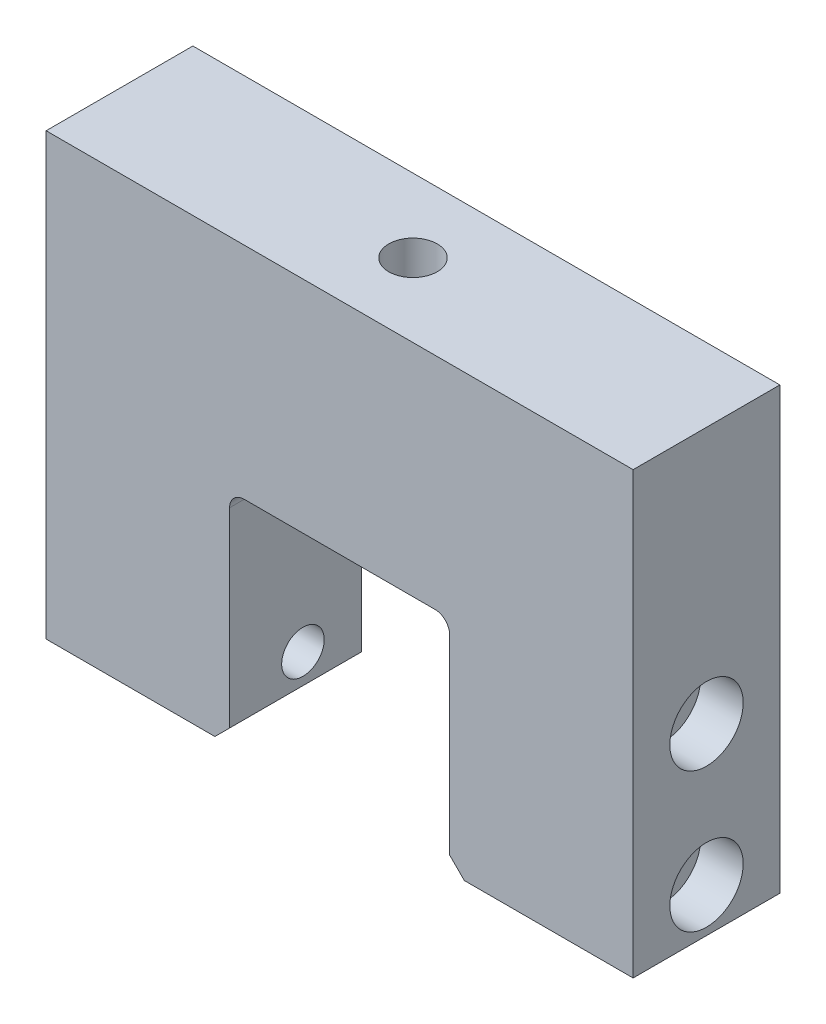
ISO-10303-21;
HEADER;
FILE_DESCRIPTION(('STEP AP214'),'2;1');
FILE_NAME('part.step','',(''),(''),'','','');
FILE_SCHEMA(('AUTOMOTIVE_DESIGN { 1 0 10303 214 1 1 1 1 }'));
ENDSEC;
DATA;
#1=APPLICATION_CONTEXT('core data for automotive mechanical design processes');
#2=APPLICATION_PROTOCOL_DEFINITION('international standard','automotive_design',2000,#1);
#3=PRODUCT_CONTEXT('',#1,'mechanical');
#4=PRODUCT('Part','Part','',(#3));
#5=PRODUCT_RELATED_PRODUCT_CATEGORY('part','',(#4));
#6=PRODUCT_DEFINITION_FORMATION('','',#4);
#7=PRODUCT_DEFINITION_CONTEXT('part definition',#1,'design');
#8=PRODUCT_DEFINITION('design','',#6,#7);
#9=PRODUCT_DEFINITION_SHAPE('','',#8);
#10=(LENGTH_UNIT() NAMED_UNIT(*) SI_UNIT(.MILLI.,.METRE.));
#11=(NAMED_UNIT(*) PLANE_ANGLE_UNIT() SI_UNIT($,.RADIAN.));
#12=(NAMED_UNIT(*) SI_UNIT($,.STERADIAN.) SOLID_ANGLE_UNIT());
#13=UNCERTAINTY_MEASURE_WITH_UNIT(LENGTH_MEASURE(1.E-05),#10,'distance_accuracy_value','');
#14=(GEOMETRIC_REPRESENTATION_CONTEXT(3) GLOBAL_UNCERTAINTY_ASSIGNED_CONTEXT((#13)) GLOBAL_UNIT_ASSIGNED_CONTEXT((#10,
#11,#12)) REPRESENTATION_CONTEXT('',''));
#15=CARTESIAN_POINT('',(0.,0.,0.));
#16=DIRECTION('',(0.,0.,1.));
#17=DIRECTION('',(1.,0.,0.));
#18=AXIS2_PLACEMENT_3D('',#15,#16,#17);
#19=CARTESIAN_POINT('',(20.,-15.,10.));
#20=DIRECTION('',(0.,1.,0.));
#21=DIRECTION('',(-1.,0.,0.));
#22=AXIS2_PLACEMENT_3D('',#19,#20,#21);
#23=PLANE('',#22);
#24=DIRECTION('',(1.,0.,0.));
#25=VECTOR('',#24,1.);
#26=CARTESIAN_POINT('',(20.,-15.,10.));
#27=LINE('',#26,#25);
#28=CARTESIAN_POINT('',(8.49999999999999,-15.,10.));
#29=VERTEX_POINT('',#28);
#30=CARTESIAN_POINT('',(20.,-15.,10.));
#31=VERTEX_POINT('',#30);
#32=EDGE_CURVE('E285',#29,#31,#27,.T.);
#33=ORIENTED_EDGE('',*,*,#32,.F.);
#34=DIRECTION('',(0.,0.,-1.));
#35=VECTOR('',#34,1.);
#36=CARTESIAN_POINT('',(8.49999999999999,-15.,10.));
#37=LINE('',#36,#35);
#38=CARTESIAN_POINT('',(8.49999999999999,-15.,0.));
#39=VERTEX_POINT('',#38);
#40=EDGE_CURVE('E363',#29,#39,#37,.T.);
#41=ORIENTED_EDGE('',*,*,#40,.T.);
#42=DIRECTION('',(1.,0.,0.));
#43=VECTOR('',#42,1.);
#44=CARTESIAN_POINT('',(20.,-15.,0.));
#45=LINE('',#44,#43);
#46=CARTESIAN_POINT('',(20.,-15.,0.));
#47=VERTEX_POINT('',#46);
#48=EDGE_CURVE('E301',#39,#47,#45,.T.);
#49=ORIENTED_EDGE('',*,*,#48,.T.);
#50=DIRECTION('',(0.,0.,-1.));
#51=VECTOR('',#50,1.);
#52=CARTESIAN_POINT('',(20.,-15.,10.));
#53=LINE('',#52,#51);
#54=EDGE_CURVE('E318',#31,#47,#53,.T.);
#55=ORIENTED_EDGE('',*,*,#54,.F.);
#56=EDGE_LOOP('',(#33,#41,#49,#55));
#57=FACE_BOUND('',#56,.T.);
#58=ADVANCED_FACE('F48',(#57),#23,.F.);
#59=CARTESIAN_POINT('',(-20.,15.,10.));
#60=DIRECTION('',(1.,0.,0.));
#61=DIRECTION('',(0.,0.,-1.));
#62=AXIS2_PLACEMENT_3D('',#59,#60,#61);
#63=PLANE('',#62);
#64=CARTESIAN_POINT('',(-20.,-2.50000000000001,5.));
#65=DIRECTION('',(-1.,0.,0.));
#66=DIRECTION('',(0.,0.,1.));
#67=AXIS2_PLACEMENT_3D('',#64,#65,#66);
#68=CIRCLE('',#67,2.5);
#69=CARTESIAN_POINT('',(-20.,-2.50000000000001,7.5));
#70=VERTEX_POINT('',#69);
#71=EDGE_CURVE('E237',#70,#70,#68,.T.);
#72=ORIENTED_EDGE('',*,*,#71,.F.);
#73=EDGE_LOOP('',(#72));
#74=FACE_BOUND('',#73,.T.);
#75=CARTESIAN_POINT('',(-20.,-12.,5.));
#76=DIRECTION('',(-1.,0.,0.));
#77=DIRECTION('',(0.,0.,1.));
#78=AXIS2_PLACEMENT_3D('',#75,#76,#77);
#79=CIRCLE('',#78,2.5);
#80=CARTESIAN_POINT('',(-20.,-12.,7.5));
#81=VERTEX_POINT('',#80);
#82=EDGE_CURVE('E253',#81,#81,#79,.T.);
#83=ORIENTED_EDGE('',*,*,#82,.F.);
#84=EDGE_LOOP('',(#83));
#85=FACE_BOUND('',#84,.T.);
#86=DIRECTION('',(0.,-1.,0.));
#87=VECTOR('',#86,1.);
#88=CARTESIAN_POINT('',(-20.,15.,0.));
#89=LINE('',#88,#87);
#90=CARTESIAN_POINT('',(-20.,15.,0.));
#91=VERTEX_POINT('',#90);
#92=CARTESIAN_POINT('',(-20.,-15.,0.));
#93=VERTEX_POINT('',#92);
#94=EDGE_CURVE('E280',#91,#93,#89,.T.);
#95=ORIENTED_EDGE('',*,*,#94,.T.);
#96=DIRECTION('',(0.,0.,-1.));
#97=VECTOR('',#96,1.);
#98=CARTESIAN_POINT('',(-20.,-15.,10.));
#99=LINE('',#98,#97);
#100=CARTESIAN_POINT('',(-20.,-15.,10.));
#101=VERTEX_POINT('',#100);
#102=EDGE_CURVE('E322',#101,#93,#99,.T.);
#103=ORIENTED_EDGE('',*,*,#102,.F.);
#104=DIRECTION('',(0.,-1.,0.));
#105=VECTOR('',#104,1.);
#106=CARTESIAN_POINT('',(-20.,15.,10.));
#107=LINE('',#106,#105);
#108=CARTESIAN_POINT('',(-20.,15.,10.));
#109=VERTEX_POINT('',#108);
#110=EDGE_CURVE('E281',#109,#101,#107,.T.);
#111=ORIENTED_EDGE('',*,*,#110,.F.);
#112=DIRECTION('',(0.,0.,-1.));
#113=VECTOR('',#112,1.);
#114=CARTESIAN_POINT('',(-20.,15.,10.));
#115=LINE('',#114,#113);
#116=EDGE_CURVE('E297',#109,#91,#115,.T.);
#117=ORIENTED_EDGE('',*,*,#116,.T.);
#118=EDGE_LOOP('',(#95,#103,#111,#117));
#119=FACE_BOUND('',#118,.T.);
#120=ADVANCED_FACE('F483',(#74,#85,#119),#63,.F.);
#121=CARTESIAN_POINT('',(-8.50000000000001,-15.,0.));
#122=VERTEX_POINT('',#121);
#123=EDGE_CURVE('E302',#93,#122,#45,.T.);
#124=ORIENTED_EDGE('',*,*,#123,.T.);
#125=DIRECTION('',(0.,0.,1.));
#126=VECTOR('',#125,1.);
#127=CARTESIAN_POINT('',(-8.50000000000001,-15.,10.));
#128=LINE('',#127,#126);
#129=CARTESIAN_POINT('',(-8.50000000000001,-15.,10.));
#130=VERTEX_POINT('',#129);
#131=EDGE_CURVE('E346',#122,#130,#128,.T.);
#132=ORIENTED_EDGE('',*,*,#131,.T.);
#133=EDGE_CURVE('E287',#101,#130,#27,.T.);
#134=ORIENTED_EDGE('',*,*,#133,.F.);
#135=ORIENTED_EDGE('',*,*,#102,.T.);
#136=EDGE_LOOP('',(#124,#132,#134,#135));
#137=FACE_BOUND('',#136,.T.);
#138=ADVANCED_FACE('F428',(#137),#23,.F.);
#139=CARTESIAN_POINT('',(20.,15.,10.));
#140=DIRECTION('',(-1.,0.,0.));
#141=DIRECTION('',(0.,-1.,0.));
#142=AXIS2_PLACEMENT_3D('',#139,#140,#141);
#143=PLANE('',#142);
#144=CARTESIAN_POINT('',(20.,-2.50000000000001,5.));
#145=DIRECTION('',(1.,0.,0.));
#146=DIRECTION('',(0.,0.,-1.));
#147=AXIS2_PLACEMENT_3D('',#144,#145,#146);
#148=CIRCLE('',#147,2.5);
#149=CARTESIAN_POINT('',(20.,-2.50000000000001,2.5));
#150=VERTEX_POINT('',#149);
#151=EDGE_CURVE('E205',#150,#150,#148,.T.);
#152=ORIENTED_EDGE('',*,*,#151,.F.);
#153=EDGE_LOOP('',(#152));
#154=FACE_BOUND('',#153,.T.);
#155=CARTESIAN_POINT('',(20.,-12.,5.));
#156=DIRECTION('',(1.,0.,0.));
#157=DIRECTION('',(0.,0.,-1.));
#158=AXIS2_PLACEMENT_3D('',#155,#156,#157);
#159=CIRCLE('',#158,2.5);
#160=CARTESIAN_POINT('',(20.,-12.,2.5));
#161=VERTEX_POINT('',#160);
#162=EDGE_CURVE('E221',#161,#161,#159,.T.);
#163=ORIENTED_EDGE('',*,*,#162,.F.);
#164=EDGE_LOOP('',(#163));
#165=FACE_BOUND('',#164,.T.);
#166=DIRECTION('',(0.,1.,0.));
#167=VECTOR('',#166,1.);
#168=CARTESIAN_POINT('',(20.,15.,0.));
#169=LINE('',#168,#167);
#170=CARTESIAN_POINT('',(20.,15.,0.));
#171=VERTEX_POINT('',#170);
#172=EDGE_CURVE('E306',#47,#171,#169,.T.);
#173=ORIENTED_EDGE('',*,*,#172,.T.);
#174=DIRECTION('',(0.,0.,-1.));
#175=VECTOR('',#174,1.);
#176=CARTESIAN_POINT('',(20.,15.,10.));
#177=LINE('',#176,#175);
#178=CARTESIAN_POINT('',(20.,15.,10.));
#179=VERTEX_POINT('',#178);
#180=EDGE_CURVE('E314',#179,#171,#177,.T.);
#181=ORIENTED_EDGE('',*,*,#180,.F.);
#182=DIRECTION('',(0.,1.,0.));
#183=VECTOR('',#182,1.);
#184=CARTESIAN_POINT('',(20.,15.,10.));
#185=LINE('',#184,#183);
#186=EDGE_CURVE('E291',#31,#179,#185,.T.);
#187=ORIENTED_EDGE('',*,*,#186,.F.);
#188=ORIENTED_EDGE('',*,*,#54,.T.);
#189=EDGE_LOOP('',(#173,#181,#187,#188));
#190=FACE_BOUND('',#189,.T.);
#191=ADVANCED_FACE('F492',(#154,#165,#190),#143,.F.);
#192=CARTESIAN_POINT('',(20.,15.,10.));
#193=DIRECTION('',(0.,-1.,0.));
#194=DIRECTION('',(1.,0.,0.));
#195=AXIS2_PLACEMENT_3D('',#192,#193,#194);
#196=PLANE('',#195);
#197=CARTESIAN_POINT('',(0.,15.,5.00000000000001));
#198=DIRECTION('',(0.,1.,0.));
#199=DIRECTION('',(0.,0.,1.));
#200=AXIS2_PLACEMENT_3D('',#197,#198,#199);
#201=CIRCLE('',#200,1.64999999999999);
#202=CARTESIAN_POINT('',(0.,15.,6.64999999999999));
#203=VERTEX_POINT('',#202);
#204=EDGE_CURVE('E602',#203,#203,#201,.T.);
#205=ORIENTED_EDGE('',*,*,#204,.F.);
#206=EDGE_LOOP('',(#205));
#207=FACE_BOUND('',#206,.T.);
#208=DIRECTION('',(-1.,0.,0.));
#209=VECTOR('',#208,1.);
#210=CARTESIAN_POINT('',(20.,15.,0.));
#211=LINE('',#210,#209);
#212=EDGE_CURVE('E286',#171,#91,#211,.T.);
#213=ORIENTED_EDGE('',*,*,#212,.T.);
#214=ORIENTED_EDGE('',*,*,#116,.F.);
#215=DIRECTION('',(-1.,0.,0.));
#216=VECTOR('',#215,1.);
#217=CARTESIAN_POINT('',(20.,15.,10.));
#218=LINE('',#217,#216);
#219=EDGE_CURVE('E294',#179,#109,#218,.T.);
#220=ORIENTED_EDGE('',*,*,#219,.F.);
#221=ORIENTED_EDGE('',*,*,#180,.T.);
#222=EDGE_LOOP('',(#213,#214,#220,#221));
#223=FACE_BOUND('',#222,.T.);
#224=ADVANCED_FACE('F496',(#207,#223),#196,.F.);
#225=CARTESIAN_POINT('',(0.,0.,10.));
#226=DIRECTION('',(0.,0.,-1.));
#227=DIRECTION('',(-1.,0.,0.));
#228=AXIS2_PLACEMENT_3D('',#225,#226,#227);
#229=PLANE('',#228);
#230=ORIENTED_EDGE('',*,*,#133,.T.);
#231=DIRECTION('',(-0.707106781186549,-0.707106781186546,0.));
#232=VECTOR('',#231,1.);
#233=CARTESIAN_POINT('',(-8.50000000000001,-15.,10.));
#234=LINE('',#233,#232);
#235=CARTESIAN_POINT('',(-7.5,-14.,10.));
#236=VERTEX_POINT('',#235);
#237=EDGE_CURVE('E353',#130,#236,#234,.F.);
#238=ORIENTED_EDGE('',*,*,#237,.T.);
#239=DIRECTION('',(0.,-1.,0.));
#240=VECTOR('',#239,1.);
#241=CARTESIAN_POINT('',(-7.5,0.,10.));
#242=LINE('',#241,#240);
#243=CARTESIAN_POINT('',(-7.5,-1.00000000000001,10.));
#244=VERTEX_POINT('',#243);
#245=EDGE_CURVE('E276',#244,#236,#242,.T.);
#246=ORIENTED_EDGE('',*,*,#245,.F.);
#247=CARTESIAN_POINT('',(-6.5,-1.00000000000001,10.));
#248=DIRECTION('',(0.,0.,-1.));
#249=DIRECTION('',(-1.,0.,0.));
#250=AXIS2_PLACEMENT_3D('',#247,#248,#249);
#251=CIRCLE('',#250,1.);
#252=CARTESIAN_POINT('',(-6.5,0.,10.));
#253=VERTEX_POINT('',#252);
#254=EDGE_CURVE('E343',#244,#253,#251,.T.);
#255=ORIENTED_EDGE('',*,*,#254,.T.);
#256=DIRECTION('',(-1.,0.,0.));
#257=VECTOR('',#256,1.);
#258=CARTESIAN_POINT('',(-7.5,0.,10.));
#259=LINE('',#258,#257);
#260=CARTESIAN_POINT('',(6.5,0.,10.));
#261=VERTEX_POINT('',#260);
#262=EDGE_CURVE('E272',#261,#253,#259,.T.);
#263=ORIENTED_EDGE('',*,*,#262,.F.);
#264=CARTESIAN_POINT('',(6.5,-1.00000000000001,10.));
#265=DIRECTION('',(0.,0.,-1.));
#266=DIRECTION('',(-1.,0.,0.));
#267=AXIS2_PLACEMENT_3D('',#264,#265,#266);
#268=CIRCLE('',#267,1.);
#269=CARTESIAN_POINT('',(7.5,-1.00000000000001,10.));
#270=VERTEX_POINT('',#269);
#271=EDGE_CURVE('E339',#261,#270,#268,.T.);
#272=ORIENTED_EDGE('',*,*,#271,.T.);
#273=DIRECTION('',(0.,1.,0.));
#274=VECTOR('',#273,1.);
#275=CARTESIAN_POINT('',(7.5,0.,10.));
#276=LINE('',#275,#274);
#277=CARTESIAN_POINT('',(7.5,-14.,10.));
#278=VERTEX_POINT('',#277);
#279=EDGE_CURVE('E269',#278,#270,#276,.T.);
#280=ORIENTED_EDGE('',*,*,#279,.F.);
#281=DIRECTION('',(-0.70710678118655,0.707106781186545,0.));
#282=VECTOR('',#281,1.);
#283=CARTESIAN_POINT('',(7.5,-14.,10.));
#284=LINE('',#283,#282);
#285=EDGE_CURVE('E350',#278,#29,#284,.F.);
#286=ORIENTED_EDGE('',*,*,#285,.T.);
#287=ORIENTED_EDGE('',*,*,#32,.T.);
#288=ORIENTED_EDGE('',*,*,#186,.T.);
#289=ORIENTED_EDGE('',*,*,#219,.T.);
#290=ORIENTED_EDGE('',*,*,#110,.T.);
#291=EDGE_LOOP('',(#230,#238,#246,#255,#263,#272,#280,#286,#287,#288,#289,#290));
#292=FACE_BOUND('',#291,.T.);
#293=ADVANCED_FACE('F435',(#292),#229,.F.);
#294=CARTESIAN_POINT('',(0.,0.,0.));
#295=DIRECTION('',(0.,0.,-1.));
#296=DIRECTION('',(-1.,0.,0.));
#297=AXIS2_PLACEMENT_3D('',#294,#295,#296);
#298=PLANE('',#297);
#299=ORIENTED_EDGE('',*,*,#48,.F.);
#300=DIRECTION('',(0.,1.,0.));
#301=VECTOR('',#300,1.);
#302=CARTESIAN_POINT('',(8.50000000000001,-1.00000000000001,0.));
#303=LINE('',#302,#301);
#304=CARTESIAN_POINT('',(8.50000000000001,-1.00000000000001,0.));
#305=VERTEX_POINT('',#304);
#306=EDGE_CURVE('E379',#39,#305,#303,.T.);
#307=ORIENTED_EDGE('',*,*,#306,.T.);
#308=CARTESIAN_POINT('',(6.5,-1.00000000000001,0.));
#309=DIRECTION('',(0.,0.,-1.));
#310=DIRECTION('',(-1.,0.,0.));
#311=AXIS2_PLACEMENT_3D('',#308,#309,#310);
#312=CIRCLE('',#311,2.00000000000001);
#313=CARTESIAN_POINT('',(6.5,1.,0.));
#314=VERTEX_POINT('',#313);
#315=EDGE_CURVE('E373',#305,#314,#312,.F.);
#316=ORIENTED_EDGE('',*,*,#315,.T.);
#317=DIRECTION('',(-1.,0.,0.));
#318=VECTOR('',#317,1.);
#319=CARTESIAN_POINT('',(-6.5,1.,0.));
#320=LINE('',#319,#318);
#321=CARTESIAN_POINT('',(-6.5,1.,0.));
#322=VERTEX_POINT('',#321);
#323=EDGE_CURVE('E367',#314,#322,#320,.T.);
#324=ORIENTED_EDGE('',*,*,#323,.T.);
#325=CARTESIAN_POINT('',(-6.5,-1.00000000000001,0.));
#326=DIRECTION('',(0.,0.,-1.));
#327=DIRECTION('',(-1.,0.,0.));
#328=AXIS2_PLACEMENT_3D('',#325,#326,#327);
#329=CIRCLE('',#328,2.00000000000001);
#330=CARTESIAN_POINT('',(-8.50000000000001,-1.00000000000001,0.));
#331=VERTEX_POINT('',#330);
#332=EDGE_CURVE('E370',#322,#331,#329,.F.);
#333=ORIENTED_EDGE('',*,*,#332,.T.);
#334=DIRECTION('',(0.,-1.,0.));
#335=VECTOR('',#334,1.);
#336=CARTESIAN_POINT('',(-8.50000000000001,-14.,0.));
#337=LINE('',#336,#335);
#338=EDGE_CURVE('E376',#331,#122,#337,.T.);
#339=ORIENTED_EDGE('',*,*,#338,.T.);
#340=ORIENTED_EDGE('',*,*,#123,.F.);
#341=ORIENTED_EDGE('',*,*,#94,.F.);
#342=ORIENTED_EDGE('',*,*,#212,.F.);
#343=ORIENTED_EDGE('',*,*,#172,.F.);
#344=EDGE_LOOP('',(#299,#307,#316,#324,#333,#339,#340,#341,#342,#343));
#345=FACE_BOUND('',#344,.T.);
#346=CARTESIAN_POINT('',(13.75,-7.,0.));
#347=DIRECTION('',(0.,0.,-1.));
#348=DIRECTION('',(-1.,0.,0.));
#349=AXIS2_PLACEMENT_3D('',#346,#347,#348);
#350=CIRCLE('',#349,1.65);
#351=CARTESIAN_POINT('',(12.1,-7.,0.));
#352=VERTEX_POINT('',#351);
#353=EDGE_CURVE('E174',#352,#352,#350,.T.);
#354=ORIENTED_EDGE('',*,*,#353,.F.);
#355=EDGE_LOOP('',(#354));
#356=FACE_BOUND('',#355,.T.);
#357=CARTESIAN_POINT('',(13.75,11.,0.));
#358=DIRECTION('',(0.,0.,-1.));
#359=DIRECTION('',(-1.,0.,0.));
#360=AXIS2_PLACEMENT_3D('',#357,#358,#359);
#361=CIRCLE('',#360,1.65);
#362=CARTESIAN_POINT('',(12.1,11.,0.));
#363=VERTEX_POINT('',#362);
#364=EDGE_CURVE('E173',#363,#363,#361,.T.);
#365=ORIENTED_EDGE('',*,*,#364,.F.);
#366=EDGE_LOOP('',(#365));
#367=FACE_BOUND('',#366,.T.);
#368=CARTESIAN_POINT('',(-13.75,11.,0.));
#369=DIRECTION('',(0.,0.,-1.));
#370=DIRECTION('',(-1.,0.,0.));
#371=AXIS2_PLACEMENT_3D('',#368,#369,#370);
#372=CIRCLE('',#371,1.65);
#373=CARTESIAN_POINT('',(-15.4,11.,0.));
#374=VERTEX_POINT('',#373);
#375=EDGE_CURVE('E189',#374,#374,#372,.T.);
#376=ORIENTED_EDGE('',*,*,#375,.F.);
#377=EDGE_LOOP('',(#376));
#378=FACE_BOUND('',#377,.T.);
#379=CARTESIAN_POINT('',(-13.75,-7.,0.));
#380=DIRECTION('',(0.,0.,-1.));
#381=DIRECTION('',(-1.,0.,0.));
#382=AXIS2_PLACEMENT_3D('',#379,#380,#381);
#383=CIRCLE('',#382,1.65);
#384=CARTESIAN_POINT('',(-15.4,-7.,0.));
#385=VERTEX_POINT('',#384);
#386=EDGE_CURVE('E197',#385,#385,#383,.T.);
#387=ORIENTED_EDGE('',*,*,#386,.F.);
#388=EDGE_LOOP('',(#387));
#389=FACE_BOUND('',#388,.T.);
#390=ADVANCED_FACE('F423',(#345,#356,#367,#378,#389),#298,.T.);
#391=CARTESIAN_POINT('',(7.5,0.,0.));
#392=DIRECTION('',(1.,0.,0.));
#393=DIRECTION('',(0.,1.,0.));
#394=AXIS2_PLACEMENT_3D('',#391,#392,#393);
#395=PLANE('',#394);
#396=CARTESIAN_POINT('',(7.5,-2.50000000000001,5.));
#397=DIRECTION('',(1.,0.,0.));
#398=DIRECTION('',(0.,1.,0.));
#399=AXIS2_PLACEMENT_3D('',#396,#397,#398);
#400=CIRCLE('',#399,1.45);
#401=CARTESIAN_POINT('',(7.5,-1.05000000000001,5.));
#402=VERTEX_POINT('',#401);
#403=EDGE_CURVE('E217',#402,#402,#400,.T.);
#404=ORIENTED_EDGE('',*,*,#403,.T.);
#405=EDGE_LOOP('',(#404));
#406=FACE_BOUND('',#405,.T.);
#407=CARTESIAN_POINT('',(7.5,-12.,5.));
#408=DIRECTION('',(1.,0.,0.));
#409=DIRECTION('',(0.,1.,0.));
#410=AXIS2_PLACEMENT_3D('',#407,#408,#409);
#411=CIRCLE('',#410,1.45);
#412=CARTESIAN_POINT('',(7.5,-10.55,5.));
#413=VERTEX_POINT('',#412);
#414=EDGE_CURVE('E233',#413,#413,#411,.T.);
#415=ORIENTED_EDGE('',*,*,#414,.T.);
#416=EDGE_LOOP('',(#415));
#417=FACE_BOUND('',#416,.T.);
#418=DIRECTION('',(0.,0.,1.));
#419=VECTOR('',#418,1.);
#420=CARTESIAN_POINT('',(7.5,-1.00000000000001,0.));
#421=LINE('',#420,#419);
#422=CARTESIAN_POINT('',(7.5,-1.00000000000001,1.00000000000001));
#423=VERTEX_POINT('',#422);
#424=EDGE_CURVE('E332',#270,#423,#421,.F.);
#425=ORIENTED_EDGE('',*,*,#424,.T.);
#426=DIRECTION('',(0.,-1.,0.));
#427=VECTOR('',#426,1.);
#428=CARTESIAN_POINT('',(7.5,-14.,1.00000000000001));
#429=LINE('',#428,#427);
#430=CARTESIAN_POINT('',(7.5,-14.,1.00000000000001));
#431=VERTEX_POINT('',#430);
#432=EDGE_CURVE('E383',#423,#431,#429,.T.);
#433=ORIENTED_EDGE('',*,*,#432,.T.);
#434=DIRECTION('',(0.,0.,1.));
#435=VECTOR('',#434,1.);
#436=CARTESIAN_POINT('',(7.5,-14.,0.));
#437=LINE('',#436,#435);
#438=EDGE_CURVE('E360',#431,#278,#437,.T.);
#439=ORIENTED_EDGE('',*,*,#438,.T.);
#440=ORIENTED_EDGE('',*,*,#279,.T.);
#441=EDGE_LOOP('',(#425,#433,#439,#440));
#442=FACE_BOUND('',#441,.T.);
#443=ADVANCED_FACE('F451',(#406,#417,#442),#395,.F.);
#444=CARTESIAN_POINT('',(-7.5,0.,0.));
#445=DIRECTION('',(-1.,0.,0.));
#446=DIRECTION('',(0.,-1.,0.));
#447=AXIS2_PLACEMENT_3D('',#444,#445,#446);
#448=PLANE('',#447);
#449=CARTESIAN_POINT('',(-7.5,-2.50000000000001,5.));
#450=DIRECTION('',(-1.,0.,0.));
#451=DIRECTION('',(0.,-1.,0.));
#452=AXIS2_PLACEMENT_3D('',#449,#450,#451);
#453=CIRCLE('',#452,1.45);
#454=CARTESIAN_POINT('',(-7.5,-3.95000000000001,5.));
#455=VERTEX_POINT('',#454);
#456=EDGE_CURVE('E249',#455,#455,#453,.T.);
#457=ORIENTED_EDGE('',*,*,#456,.T.);
#458=EDGE_LOOP('',(#457));
#459=FACE_BOUND('',#458,.T.);
#460=CARTESIAN_POINT('',(-7.5,-12.,5.));
#461=DIRECTION('',(-1.,0.,0.));
#462=DIRECTION('',(0.,-1.,0.));
#463=AXIS2_PLACEMENT_3D('',#460,#461,#462);
#464=CIRCLE('',#463,1.45);
#465=CARTESIAN_POINT('',(-7.5,-13.45,5.));
#466=VERTEX_POINT('',#465);
#467=EDGE_CURVE('E265',#466,#466,#464,.T.);
#468=ORIENTED_EDGE('',*,*,#467,.T.);
#469=EDGE_LOOP('',(#468));
#470=FACE_BOUND('',#469,.T.);
#471=DIRECTION('',(0.,0.,-1.));
#472=VECTOR('',#471,1.);
#473=CARTESIAN_POINT('',(-7.5,-14.,0.));
#474=LINE('',#473,#472);
#475=CARTESIAN_POINT('',(-7.5,-14.,1.00000000000001));
#476=VERTEX_POINT('',#475);
#477=EDGE_CURVE('E356',#236,#476,#474,.T.);
#478=ORIENTED_EDGE('',*,*,#477,.T.);
#479=DIRECTION('',(0.,1.,0.));
#480=VECTOR('',#479,1.);
#481=CARTESIAN_POINT('',(-7.5,-1.00000000000001,1.00000000000001));
#482=LINE('',#481,#480);
#483=CARTESIAN_POINT('',(-7.5,-1.00000000000001,1.00000000000001));
#484=VERTEX_POINT('',#483);
#485=EDGE_CURVE('E392',#476,#484,#482,.T.);
#486=ORIENTED_EDGE('',*,*,#485,.T.);
#487=DIRECTION('',(0.,0.,1.));
#488=VECTOR('',#487,1.);
#489=CARTESIAN_POINT('',(-7.5,-1.00000000000001,10.));
#490=LINE('',#489,#488);
#491=EDGE_CURVE('E336',#484,#244,#490,.T.);
#492=ORIENTED_EDGE('',*,*,#491,.T.);
#493=ORIENTED_EDGE('',*,*,#245,.T.);
#494=EDGE_LOOP('',(#478,#486,#492,#493));
#495=FACE_BOUND('',#494,.T.);
#496=ADVANCED_FACE('F437',(#459,#470,#495),#448,.F.);
#497=CARTESIAN_POINT('',(-7.5,0.,0.));
#498=DIRECTION('',(0.,1.,0.));
#499=DIRECTION('',(0.,0.,1.));
#500=AXIS2_PLACEMENT_3D('',#497,#498,#499);
#501=PLANE('',#500);
#502=CARTESIAN_POINT('',(0.,0.,5.00000000000001));
#503=DIRECTION('',(0.,1.,0.));
#504=DIRECTION('',(0.,0.,1.));
#505=AXIS2_PLACEMENT_3D('',#502,#503,#504);
#506=CIRCLE('',#505,1.64999999999999);
#507=CARTESIAN_POINT('',(0.,0.,6.65));
#508=VERTEX_POINT('',#507);
#509=EDGE_CURVE('E53',#508,#508,#506,.T.);
#510=ORIENTED_EDGE('',*,*,#509,.T.);
#511=EDGE_LOOP('',(#510));
#512=FACE_BOUND('',#511,.T.);
#513=DIRECTION('',(0.,0.,1.));
#514=VECTOR('',#513,1.);
#515=CARTESIAN_POINT('',(-6.5,0.,0.));
#516=LINE('',#515,#514);
#517=CARTESIAN_POINT('',(-6.5,0.,1.00000000000001));
#518=VERTEX_POINT('',#517);
#519=EDGE_CURVE('E326',#253,#518,#516,.F.);
#520=ORIENTED_EDGE('',*,*,#519,.T.);
#521=DIRECTION('',(1.,0.,0.));
#522=VECTOR('',#521,1.);
#523=CARTESIAN_POINT('',(6.5,0.,1.00000000000001));
#524=LINE('',#523,#522);
#525=CARTESIAN_POINT('',(6.5,0.,1.00000000000001));
#526=VERTEX_POINT('',#525);
#527=EDGE_CURVE('E11',#518,#526,#524,.T.);
#528=ORIENTED_EDGE('',*,*,#527,.T.);
#529=DIRECTION('',(0.,0.,1.));
#530=VECTOR('',#529,1.);
#531=CARTESIAN_POINT('',(6.5,0.,10.));
#532=LINE('',#531,#530);
#533=EDGE_CURVE('E329',#526,#261,#532,.T.);
#534=ORIENTED_EDGE('',*,*,#533,.T.);
#535=ORIENTED_EDGE('',*,*,#262,.T.);
#536=EDGE_LOOP('',(#520,#528,#534,#535));
#537=FACE_BOUND('',#536,.T.);
#538=ADVANCED_FACE('F441',(#512,#537),#501,.F.);
#539=CARTESIAN_POINT('',(-20.,-12.,5.));
#540=DIRECTION('',(-1.,0.,0.));
#541=DIRECTION('',(0.,0.,1.));
#542=AXIS2_PLACEMENT_3D('',#539,#540,#541);
#543=CYLINDRICAL_SURFACE('',#542,1.45);
#544=ORIENTED_EDGE('',*,*,#467,.F.);
#545=EDGE_LOOP('',(#544));
#546=FACE_BOUND('',#545,.T.);
#547=CARTESIAN_POINT('',(-17.1,-12.,5.));
#548=DIRECTION('',(-1.,0.,0.));
#549=DIRECTION('',(0.,0.,1.));
#550=AXIS2_PLACEMENT_3D('',#547,#548,#549);
#551=CIRCLE('',#550,1.45);
#552=CARTESIAN_POINT('',(-17.1,-12.,6.45));
#553=VERTEX_POINT('',#552);
#554=EDGE_CURVE('E261',#553,#553,#551,.T.);
#555=ORIENTED_EDGE('',*,*,#554,.T.);
#556=EDGE_LOOP('',(#555));
#557=FACE_BOUND('',#556,.T.);
#558=ADVANCED_FACE('F515',(#546,#557),#543,.F.);
#559=CARTESIAN_POINT('',(-17.1,-10.55,5.));
#560=DIRECTION('',(1.,0.,0.));
#561=DIRECTION('',(0.,0.,-1.));
#562=AXIS2_PLACEMENT_3D('',#559,#560,#561);
#563=PLANE('',#562);
#564=ORIENTED_EDGE('',*,*,#554,.F.);
#565=EDGE_LOOP('',(#564));
#566=FACE_BOUND('',#565,.T.);
#567=CARTESIAN_POINT('',(-17.1,-12.,5.));
#568=DIRECTION('',(-1.,0.,0.));
#569=DIRECTION('',(0.,0.,1.));
#570=AXIS2_PLACEMENT_3D('',#567,#568,#569);
#571=CIRCLE('',#570,2.5);
#572=CARTESIAN_POINT('',(-17.1,-12.,7.5));
#573=VERTEX_POINT('',#572);
#574=EDGE_CURVE('E257',#573,#573,#571,.T.);
#575=ORIENTED_EDGE('',*,*,#574,.T.);
#576=EDGE_LOOP('',(#575));
#577=FACE_BOUND('',#576,.T.);
#578=ADVANCED_FACE('F522',(#566,#577),#563,.F.);
#579=CARTESIAN_POINT('',(-20.,-12.,5.));
#580=DIRECTION('',(-1.,0.,0.));
#581=DIRECTION('',(0.,0.,1.));
#582=AXIS2_PLACEMENT_3D('',#579,#580,#581);
#583=CYLINDRICAL_SURFACE('',#582,2.5);
#584=ORIENTED_EDGE('',*,*,#574,.F.);
#585=EDGE_LOOP('',(#584));
#586=FACE_BOUND('',#585,.T.);
#587=ORIENTED_EDGE('',*,*,#82,.T.);
#588=EDGE_LOOP('',(#587));
#589=FACE_BOUND('',#588,.T.);
#590=ADVANCED_FACE('F526',(#586,#589),#583,.F.);
#591=CARTESIAN_POINT('',(-20.,-2.50000000000001,5.));
#592=DIRECTION('',(-1.,0.,0.));
#593=DIRECTION('',(0.,0.,1.));
#594=AXIS2_PLACEMENT_3D('',#591,#592,#593);
#595=CYLINDRICAL_SURFACE('',#594,1.45);
#596=ORIENTED_EDGE('',*,*,#456,.F.);
#597=EDGE_LOOP('',(#596));
#598=FACE_BOUND('',#597,.T.);
#599=CARTESIAN_POINT('',(-17.1,-2.50000000000001,5.));
#600=DIRECTION('',(-1.,0.,0.));
#601=DIRECTION('',(0.,0.,1.));
#602=AXIS2_PLACEMENT_3D('',#599,#600,#601);
#603=CIRCLE('',#602,1.45);
#604=CARTESIAN_POINT('',(-17.1,-2.50000000000001,6.45));
#605=VERTEX_POINT('',#604);
#606=EDGE_CURVE('E245',#605,#605,#603,.T.);
#607=ORIENTED_EDGE('',*,*,#606,.T.);
#608=EDGE_LOOP('',(#607));
#609=FACE_BOUND('',#608,.T.);
#610=ADVANCED_FACE('F530',(#598,#609),#595,.F.);
#611=CARTESIAN_POINT('',(-17.1,-1.05000000000001,5.));
#612=DIRECTION('',(1.,0.,0.));
#613=DIRECTION('',(0.,0.,-1.));
#614=AXIS2_PLACEMENT_3D('',#611,#612,#613);
#615=PLANE('',#614);
#616=ORIENTED_EDGE('',*,*,#606,.F.);
#617=EDGE_LOOP('',(#616));
#618=FACE_BOUND('',#617,.T.);
#619=CARTESIAN_POINT('',(-17.1,-2.50000000000001,5.));
#620=DIRECTION('',(-1.,0.,0.));
#621=DIRECTION('',(0.,0.,1.));
#622=AXIS2_PLACEMENT_3D('',#619,#620,#621);
#623=CIRCLE('',#622,2.5);
#624=CARTESIAN_POINT('',(-17.1,-2.50000000000001,7.5));
#625=VERTEX_POINT('',#624);
#626=EDGE_CURVE('E241',#625,#625,#623,.T.);
#627=ORIENTED_EDGE('',*,*,#626,.T.);
#628=EDGE_LOOP('',(#627));
#629=FACE_BOUND('',#628,.T.);
#630=ADVANCED_FACE('F534',(#618,#629),#615,.F.);
#631=CARTESIAN_POINT('',(-20.,-2.50000000000001,5.));
#632=DIRECTION('',(-1.,0.,0.));
#633=DIRECTION('',(0.,0.,1.));
#634=AXIS2_PLACEMENT_3D('',#631,#632,#633);
#635=CYLINDRICAL_SURFACE('',#634,2.5);
#636=ORIENTED_EDGE('',*,*,#626,.F.);
#637=EDGE_LOOP('',(#636));
#638=FACE_BOUND('',#637,.T.);
#639=ORIENTED_EDGE('',*,*,#71,.T.);
#640=EDGE_LOOP('',(#639));
#641=FACE_BOUND('',#640,.T.);
#642=ADVANCED_FACE('F538',(#638,#641),#635,.F.);
#643=CARTESIAN_POINT('',(20.,-12.,5.));
#644=DIRECTION('',(1.,0.,0.));
#645=DIRECTION('',(0.,0.,-1.));
#646=AXIS2_PLACEMENT_3D('',#643,#644,#645);
#647=CYLINDRICAL_SURFACE('',#646,1.45);
#648=ORIENTED_EDGE('',*,*,#414,.F.);
#649=EDGE_LOOP('',(#648));
#650=FACE_BOUND('',#649,.T.);
#651=CARTESIAN_POINT('',(17.1,-12.,5.));
#652=DIRECTION('',(1.,0.,0.));
#653=DIRECTION('',(0.,0.,-1.));
#654=AXIS2_PLACEMENT_3D('',#651,#652,#653);
#655=CIRCLE('',#654,1.45);
#656=CARTESIAN_POINT('',(17.1,-12.,3.55));
#657=VERTEX_POINT('',#656);
#658=EDGE_CURVE('E229',#657,#657,#655,.T.);
#659=ORIENTED_EDGE('',*,*,#658,.T.);
#660=EDGE_LOOP('',(#659));
#661=FACE_BOUND('',#660,.T.);
#662=ADVANCED_FACE('F542',(#650,#661),#647,.F.);
#663=CARTESIAN_POINT('',(17.1,-10.55,5.));
#664=DIRECTION('',(-1.,0.,0.));
#665=DIRECTION('',(0.,0.,1.));
#666=AXIS2_PLACEMENT_3D('',#663,#664,#665);
#667=PLANE('',#666);
#668=ORIENTED_EDGE('',*,*,#658,.F.);
#669=EDGE_LOOP('',(#668));
#670=FACE_BOUND('',#669,.T.);
#671=CARTESIAN_POINT('',(17.1,-12.,5.));
#672=DIRECTION('',(1.,0.,0.));
#673=DIRECTION('',(0.,0.,-1.));
#674=AXIS2_PLACEMENT_3D('',#671,#672,#673);
#675=CIRCLE('',#674,2.5);
#676=CARTESIAN_POINT('',(17.1,-12.,2.5));
#677=VERTEX_POINT('',#676);
#678=EDGE_CURVE('E225',#677,#677,#675,.T.);
#679=ORIENTED_EDGE('',*,*,#678,.T.);
#680=EDGE_LOOP('',(#679));
#681=FACE_BOUND('',#680,.T.);
#682=ADVANCED_FACE('F546',(#670,#681),#667,.F.);
#683=CARTESIAN_POINT('',(20.,-12.,5.));
#684=DIRECTION('',(1.,0.,0.));
#685=DIRECTION('',(0.,0.,-1.));
#686=AXIS2_PLACEMENT_3D('',#683,#684,#685);
#687=CYLINDRICAL_SURFACE('',#686,2.5);
#688=ORIENTED_EDGE('',*,*,#678,.F.);
#689=EDGE_LOOP('',(#688));
#690=FACE_BOUND('',#689,.T.);
#691=ORIENTED_EDGE('',*,*,#162,.T.);
#692=EDGE_LOOP('',(#691));
#693=FACE_BOUND('',#692,.T.);
#694=ADVANCED_FACE('F550',(#690,#693),#687,.F.);
#695=CARTESIAN_POINT('',(20.,-2.50000000000001,5.));
#696=DIRECTION('',(1.,0.,0.));
#697=DIRECTION('',(0.,0.,-1.));
#698=AXIS2_PLACEMENT_3D('',#695,#696,#697);
#699=CYLINDRICAL_SURFACE('',#698,1.45);
#700=ORIENTED_EDGE('',*,*,#403,.F.);
#701=EDGE_LOOP('',(#700));
#702=FACE_BOUND('',#701,.T.);
#703=CARTESIAN_POINT('',(17.1,-2.50000000000001,5.));
#704=DIRECTION('',(1.,0.,0.));
#705=DIRECTION('',(0.,0.,-1.));
#706=AXIS2_PLACEMENT_3D('',#703,#704,#705);
#707=CIRCLE('',#706,1.45);
#708=CARTESIAN_POINT('',(17.1,-2.50000000000001,3.55));
#709=VERTEX_POINT('',#708);
#710=EDGE_CURVE('E213',#709,#709,#707,.T.);
#711=ORIENTED_EDGE('',*,*,#710,.T.);
#712=EDGE_LOOP('',(#711));
#713=FACE_BOUND('',#712,.T.);
#714=ADVANCED_FACE('F554',(#702,#713),#699,.F.);
#715=CARTESIAN_POINT('',(17.1,-1.05000000000001,5.));
#716=DIRECTION('',(-1.,0.,0.));
#717=DIRECTION('',(0.,0.,1.));
#718=AXIS2_PLACEMENT_3D('',#715,#716,#717);
#719=PLANE('',#718);
#720=ORIENTED_EDGE('',*,*,#710,.F.);
#721=EDGE_LOOP('',(#720));
#722=FACE_BOUND('',#721,.T.);
#723=CARTESIAN_POINT('',(17.1,-2.50000000000001,5.));
#724=DIRECTION('',(1.,0.,0.));
#725=DIRECTION('',(0.,0.,-1.));
#726=AXIS2_PLACEMENT_3D('',#723,#724,#725);
#727=CIRCLE('',#726,2.5);
#728=CARTESIAN_POINT('',(17.1,-2.50000000000001,2.5));
#729=VERTEX_POINT('',#728);
#730=EDGE_CURVE('E209',#729,#729,#727,.T.);
#731=ORIENTED_EDGE('',*,*,#730,.T.);
#732=EDGE_LOOP('',(#731));
#733=FACE_BOUND('',#732,.T.);
#734=ADVANCED_FACE('F558',(#722,#733),#719,.F.);
#735=CARTESIAN_POINT('',(20.,-2.50000000000001,5.));
#736=DIRECTION('',(1.,0.,0.));
#737=DIRECTION('',(0.,0.,-1.));
#738=AXIS2_PLACEMENT_3D('',#735,#736,#737);
#739=CYLINDRICAL_SURFACE('',#738,2.5);
#740=ORIENTED_EDGE('',*,*,#730,.F.);
#741=EDGE_LOOP('',(#740));
#742=FACE_BOUND('',#741,.T.);
#743=ORIENTED_EDGE('',*,*,#151,.T.);
#744=EDGE_LOOP('',(#743));
#745=FACE_BOUND('',#744,.T.);
#746=ADVANCED_FACE('F562',(#742,#745),#739,.F.);
#747=CARTESIAN_POINT('',(-13.75,-7.,5.));
#748=DIRECTION('',(0.,0.,-1.));
#749=DIRECTION('',(-1.,0.,0.));
#750=AXIS2_PLACEMENT_3D('',#747,#748,#749);
#751=CONICAL_SURFACE('',#750,1.65,1.02974425867665);
#752=CARTESIAN_POINT('',(-13.75,-7.,5.99142002139547));
#753=VERTEX_POINT('',#752);
#754=VERTEX_LOOP('',#753);
#755=FACE_BOUND('',#754,.T.);
#756=CARTESIAN_POINT('',(-13.75,-7.,5.));
#757=DIRECTION('',(0.,0.,-1.));
#758=DIRECTION('',(-1.,0.,0.));
#759=AXIS2_PLACEMENT_3D('',#756,#757,#758);
#760=CIRCLE('',#759,1.65);
#761=CARTESIAN_POINT('',(-15.4,-7.,5.));
#762=VERTEX_POINT('',#761);
#763=EDGE_CURVE('E201',#762,#762,#760,.T.);
#764=ORIENTED_EDGE('',*,*,#763,.T.);
#765=EDGE_LOOP('',(#764));
#766=FACE_BOUND('',#765,.T.);
#767=ADVANCED_FACE('F566',(#755,#766),#751,.F.);
#768=CARTESIAN_POINT('',(-13.75,-7.,0.));
#769=DIRECTION('',(0.,0.,-1.));
#770=DIRECTION('',(-1.,0.,0.));
#771=AXIS2_PLACEMENT_3D('',#768,#769,#770);
#772=CYLINDRICAL_SURFACE('',#771,1.65);
#773=ORIENTED_EDGE('',*,*,#763,.F.);
#774=EDGE_LOOP('',(#773));
#775=FACE_BOUND('',#774,.T.);
#776=ORIENTED_EDGE('',*,*,#386,.T.);
#777=EDGE_LOOP('',(#776));
#778=FACE_BOUND('',#777,.T.);
#779=ADVANCED_FACE('F570',(#775,#778),#772,.F.);
#780=CARTESIAN_POINT('',(-13.75,11.,5.));
#781=DIRECTION('',(0.,0.,-1.));
#782=DIRECTION('',(-1.,0.,0.));
#783=AXIS2_PLACEMENT_3D('',#780,#781,#782);
#784=CONICAL_SURFACE('',#783,1.65,1.02974425867665);
#785=CARTESIAN_POINT('',(-13.75,11.,5.99142002139547));
#786=VERTEX_POINT('',#785);
#787=VERTEX_LOOP('',#786);
#788=FACE_BOUND('',#787,.T.);
#789=CARTESIAN_POINT('',(-13.75,11.,5.));
#790=DIRECTION('',(0.,0.,-1.));
#791=DIRECTION('',(-1.,0.,0.));
#792=AXIS2_PLACEMENT_3D('',#789,#790,#791);
#793=CIRCLE('',#792,1.65);
#794=CARTESIAN_POINT('',(-15.4,11.,5.));
#795=VERTEX_POINT('',#794);
#796=EDGE_CURVE('E193',#795,#795,#793,.T.);
#797=ORIENTED_EDGE('',*,*,#796,.T.);
#798=EDGE_LOOP('',(#797));
#799=FACE_BOUND('',#798,.T.);
#800=ADVANCED_FACE('F574',(#788,#799),#784,.F.);
#801=CARTESIAN_POINT('',(-13.75,11.,0.));
#802=DIRECTION('',(0.,0.,-1.));
#803=DIRECTION('',(-1.,0.,0.));
#804=AXIS2_PLACEMENT_3D('',#801,#802,#803);
#805=CYLINDRICAL_SURFACE('',#804,1.65);
#806=ORIENTED_EDGE('',*,*,#796,.F.);
#807=EDGE_LOOP('',(#806));
#808=FACE_BOUND('',#807,.T.);
#809=ORIENTED_EDGE('',*,*,#375,.T.);
#810=EDGE_LOOP('',(#809));
#811=FACE_BOUND('',#810,.T.);
#812=ADVANCED_FACE('F578',(#808,#811),#805,.F.);
#813=CARTESIAN_POINT('',(13.75,11.,5.));
#814=DIRECTION('',(0.,0.,-1.));
#815=DIRECTION('',(-1.,0.,0.));
#816=AXIS2_PLACEMENT_3D('',#813,#814,#815);
#817=CONICAL_SURFACE('',#816,1.65,1.02974425867665);
#818=CARTESIAN_POINT('',(13.75,11.,5.99142002139547));
#819=VERTEX_POINT('',#818);
#820=VERTEX_LOOP('',#819);
#821=FACE_BOUND('',#820,.T.);
#822=CARTESIAN_POINT('',(13.75,11.,5.));
#823=DIRECTION('',(0.,0.,-1.));
#824=DIRECTION('',(-1.,0.,0.));
#825=AXIS2_PLACEMENT_3D('',#822,#823,#824);
#826=CIRCLE('',#825,1.65);
#827=CARTESIAN_POINT('',(12.1,11.,5.));
#828=VERTEX_POINT('',#827);
#829=EDGE_CURVE('E179',#828,#828,#826,.T.);
#830=ORIENTED_EDGE('',*,*,#829,.T.);
#831=EDGE_LOOP('',(#830));
#832=FACE_BOUND('',#831,.T.);
#833=ADVANCED_FACE('F582',(#821,#832),#817,.F.);
#834=CARTESIAN_POINT('',(13.75,11.,0.));
#835=DIRECTION('',(0.,0.,-1.));
#836=DIRECTION('',(-1.,0.,0.));
#837=AXIS2_PLACEMENT_3D('',#834,#835,#836);
#838=CYLINDRICAL_SURFACE('',#837,1.65);
#839=ORIENTED_EDGE('',*,*,#829,.F.);
#840=EDGE_LOOP('',(#839));
#841=FACE_BOUND('',#840,.T.);
#842=ORIENTED_EDGE('',*,*,#364,.T.);
#843=EDGE_LOOP('',(#842));
#844=FACE_BOUND('',#843,.T.);
#845=ADVANCED_FACE('F166',(#841,#844),#838,.F.);
#846=CARTESIAN_POINT('',(13.75,-7.,5.));
#847=DIRECTION('',(0.,0.,-1.));
#848=DIRECTION('',(-1.,0.,0.));
#849=AXIS2_PLACEMENT_3D('',#846,#847,#848);
#850=CONICAL_SURFACE('',#849,1.65,1.02974425867665);
#851=CARTESIAN_POINT('',(13.75,-7.,5.99142002139547));
#852=VERTEX_POINT('',#851);
#853=VERTEX_LOOP('',#852);
#854=FACE_BOUND('',#853,.T.);
#855=CARTESIAN_POINT('',(13.75,-7.,5.));
#856=DIRECTION('',(0.,0.,-1.));
#857=DIRECTION('',(-1.,0.,0.));
#858=AXIS2_PLACEMENT_3D('',#855,#856,#857);
#859=CIRCLE('',#858,1.65);
#860=CARTESIAN_POINT('',(12.1,-7.,5.));
#861=VERTEX_POINT('',#860);
#862=EDGE_CURVE('E170',#861,#861,#859,.T.);
#863=ORIENTED_EDGE('',*,*,#862,.T.);
#864=EDGE_LOOP('',(#863));
#865=FACE_BOUND('',#864,.T.);
#866=ADVANCED_FACE('F162',(#854,#865),#850,.F.);
#867=CARTESIAN_POINT('',(13.75,-7.,0.));
#868=DIRECTION('',(0.,0.,-1.));
#869=DIRECTION('',(-1.,0.,0.));
#870=AXIS2_PLACEMENT_3D('',#867,#868,#869);
#871=CYLINDRICAL_SURFACE('',#870,1.65);
#872=ORIENTED_EDGE('',*,*,#862,.F.);
#873=EDGE_LOOP('',(#872));
#874=FACE_BOUND('',#873,.T.);
#875=ORIENTED_EDGE('',*,*,#353,.T.);
#876=EDGE_LOOP('',(#875));
#877=FACE_BOUND('',#876,.T.);
#878=ADVANCED_FACE('F165',(#874,#877),#871,.F.);
#879=CARTESIAN_POINT('',(6.5,-1.00000000000001,0.));
#880=DIRECTION('',(0.,0.,-1.));
#881=DIRECTION('',(-1.,0.,0.));
#882=AXIS2_PLACEMENT_3D('',#879,#880,#881);
#883=CYLINDRICAL_SURFACE('',#882,1.);
#884=ORIENTED_EDGE('',*,*,#533,.F.);
#885=CARTESIAN_POINT('',(6.5,-1.00000000000001,1.00000000000001));
#886=DIRECTION('',(0.,0.,-1.));
#887=DIRECTION('',(-1.,0.,0.));
#888=AXIS2_PLACEMENT_3D('',#885,#886,#887);
#889=CIRCLE('',#888,1.);
#890=EDGE_CURVE('E395',#526,#423,#889,.T.);
#891=ORIENTED_EDGE('',*,*,#890,.T.);
#892=ORIENTED_EDGE('',*,*,#424,.F.);
#893=ORIENTED_EDGE('',*,*,#271,.F.);
#894=EDGE_LOOP('',(#884,#891,#892,#893));
#895=FACE_BOUND('',#894,.T.);
#896=ADVANCED_FACE('F446',(#895),#883,.F.);
#897=CARTESIAN_POINT('',(-6.5,-1.00000000000001,0.));
#898=DIRECTION('',(0.,0.,-1.));
#899=DIRECTION('',(-1.,0.,0.));
#900=AXIS2_PLACEMENT_3D('',#897,#898,#899);
#901=CYLINDRICAL_SURFACE('',#900,1.);
#902=ORIENTED_EDGE('',*,*,#491,.F.);
#903=CARTESIAN_POINT('',(-6.5,-1.00000000000001,1.00000000000001));
#904=DIRECTION('',(0.,0.,-1.));
#905=DIRECTION('',(-1.,0.,0.));
#906=AXIS2_PLACEMENT_3D('',#903,#904,#905);
#907=CIRCLE('',#906,1.);
#908=EDGE_CURVE('E59',#484,#518,#907,.T.);
#909=ORIENTED_EDGE('',*,*,#908,.T.);
#910=ORIENTED_EDGE('',*,*,#519,.F.);
#911=ORIENTED_EDGE('',*,*,#254,.F.);
#912=EDGE_LOOP('',(#902,#909,#910,#911));
#913=FACE_BOUND('',#912,.T.);
#914=ADVANCED_FACE('F439',(#913),#901,.F.);
#915=CARTESIAN_POINT('',(-8.50000000000001,-15.,10.));
#916=DIRECTION('',(-0.707106781186546,0.707106781186549,0.));
#917=DIRECTION('',(0.,0.,1.));
#918=AXIS2_PLACEMENT_3D('',#915,#916,#917);
#919=PLANE('',#918);
#920=ORIENTED_EDGE('',*,*,#131,.F.);
#921=DIRECTION('',(-0.577350269189626,-0.577350269189624,-0.577350269189627));
#922=VECTOR('',#921,1.);
#923=CARTESIAN_POINT('',(-5.16666666666667,-11.6666666666667,3.33333333333334));
#924=LINE('',#923,#922);
#925=EDGE_CURVE('E389',#122,#476,#924,.F.);
#926=ORIENTED_EDGE('',*,*,#925,.T.);
#927=ORIENTED_EDGE('',*,*,#477,.F.);
#928=ORIENTED_EDGE('',*,*,#237,.F.);
#929=EDGE_LOOP('',(#920,#926,#927,#928));
#930=FACE_BOUND('',#929,.T.);
#931=ADVANCED_FACE('F431',(#930),#919,.F.);
#932=CARTESIAN_POINT('',(7.5,-14.,0.));
#933=DIRECTION('',(0.707106781186545,0.70710678118655,0.));
#934=DIRECTION('',(0.,0.,1.));
#935=AXIS2_PLACEMENT_3D('',#932,#933,#934);
#936=PLANE('',#935);
#937=ORIENTED_EDGE('',*,*,#438,.F.);
#938=DIRECTION('',(-0.577350269189627,0.577350269189623,0.577350269189627));
#939=VECTOR('',#938,1.);
#940=CARTESIAN_POINT('',(7.83333333333334,-14.3333333333333,0.66666666666667));
#941=LINE('',#940,#939);
#942=EDGE_CURVE('E386',#431,#39,#941,.F.);
#943=ORIENTED_EDGE('',*,*,#942,.T.);
#944=ORIENTED_EDGE('',*,*,#40,.F.);
#945=ORIENTED_EDGE('',*,*,#285,.F.);
#946=EDGE_LOOP('',(#937,#943,#944,#945));
#947=FACE_BOUND('',#946,.T.);
#948=ADVANCED_FACE('F457',(#947),#936,.F.);
#949=CARTESIAN_POINT('',(-8.50000000000001,0.,0.));
#950=DIRECTION('',(0.707106781186547,0.,-0.707106781186547));
#951=DIRECTION('',(0.,1.,0.));
#952=AXIS2_PLACEMENT_3D('',#949,#950,#951);
#953=PLANE('',#952);
#954=ORIENTED_EDGE('',*,*,#925,.F.);
#955=ORIENTED_EDGE('',*,*,#338,.F.);
#956=DIRECTION('',(-0.707106781186547,0.,-0.707106781186547));
#957=VECTOR('',#956,1.);
#958=CARTESIAN_POINT('',(-7.5,-1.00000000000001,1.00000000000001));
#959=LINE('',#958,#957);
#960=EDGE_CURVE('E182',#484,#331,#959,.T.);
#961=ORIENTED_EDGE('',*,*,#960,.F.);
#962=ORIENTED_EDGE('',*,*,#485,.F.);
#963=EDGE_LOOP('',(#954,#955,#961,#962));
#964=FACE_BOUND('',#963,.T.);
#965=ADVANCED_FACE('F51',(#964),#953,.T.);
#966=CARTESIAN_POINT('',(-6.5,-1.00000000000001,0.));
#967=DIRECTION('',(0.,0.,-1.));
#968=DIRECTION('',(-1.,0.,0.));
#969=AXIS2_PLACEMENT_3D('',#966,#967,#968);
#970=CONICAL_SURFACE('',#969,2.00000000000001,0.785398163397448);
#971=ORIENTED_EDGE('',*,*,#960,.T.);
#972=ORIENTED_EDGE('',*,*,#332,.F.);
#973=DIRECTION('',(0.,0.707106781186547,-0.707106781186547));
#974=VECTOR('',#973,1.);
#975=CARTESIAN_POINT('',(-6.5,0.,1.00000000000001));
#976=LINE('',#975,#974);
#977=EDGE_CURVE('E407',#518,#322,#976,.T.);
#978=ORIENTED_EDGE('',*,*,#977,.F.);
#979=ORIENTED_EDGE('',*,*,#908,.F.);
#980=EDGE_LOOP('',(#971,#972,#978,#979));
#981=FACE_BOUND('',#980,.T.);
#982=ADVANCED_FACE('F415',(#981),#970,.F.);
#983=CARTESIAN_POINT('',(0.,1.,0.));
#984=DIRECTION('',(0.,-0.707106781186547,-0.707106781186547));
#985=DIRECTION('',(1.,0.,0.));
#986=AXIS2_PLACEMENT_3D('',#983,#984,#985);
#987=PLANE('',#986);
#988=ORIENTED_EDGE('',*,*,#977,.T.);
#989=ORIENTED_EDGE('',*,*,#323,.F.);
#990=DIRECTION('',(0.,0.707106781186547,-0.707106781186547));
#991=VECTOR('',#990,1.);
#992=CARTESIAN_POINT('',(6.5,0.,1.00000000000001));
#993=LINE('',#992,#991);
#994=EDGE_CURVE('E403',#526,#314,#993,.T.);
#995=ORIENTED_EDGE('',*,*,#994,.F.);
#996=ORIENTED_EDGE('',*,*,#527,.F.);
#997=EDGE_LOOP('',(#988,#989,#995,#996));
#998=FACE_BOUND('',#997,.T.);
#999=ADVANCED_FACE('F473',(#998),#987,.T.);
#1000=CARTESIAN_POINT('',(6.5,-1.00000000000001,0.));
#1001=DIRECTION('',(0.,0.,-1.));
#1002=DIRECTION('',(-1.,0.,0.));
#1003=AXIS2_PLACEMENT_3D('',#1000,#1001,#1002);
#1004=CONICAL_SURFACE('',#1003,2.00000000000001,0.785398163397448);
#1005=ORIENTED_EDGE('',*,*,#994,.T.);
#1006=ORIENTED_EDGE('',*,*,#315,.F.);
#1007=DIRECTION('',(0.707106781186548,0.,-0.707106781186547));
#1008=VECTOR('',#1007,1.);
#1009=CARTESIAN_POINT('',(7.5,-1.00000000000001,1.00000000000001));
#1010=LINE('',#1009,#1008);
#1011=EDGE_CURVE('E400',#423,#305,#1010,.T.);
#1012=ORIENTED_EDGE('',*,*,#1011,.F.);
#1013=ORIENTED_EDGE('',*,*,#890,.F.);
#1014=EDGE_LOOP('',(#1005,#1006,#1012,#1013));
#1015=FACE_BOUND('',#1014,.T.);
#1016=ADVANCED_FACE('F470',(#1015),#1004,.F.);
#1017=CARTESIAN_POINT('',(8.50000000000001,0.,0.));
#1018=DIRECTION('',(-0.707106781186547,0.,-0.707106781186547));
#1019=DIRECTION('',(0.,-1.,0.));
#1020=AXIS2_PLACEMENT_3D('',#1017,#1018,#1019);
#1021=PLANE('',#1020);
#1022=ORIENTED_EDGE('',*,*,#942,.F.);
#1023=ORIENTED_EDGE('',*,*,#432,.F.);
#1024=ORIENTED_EDGE('',*,*,#1011,.T.);
#1025=ORIENTED_EDGE('',*,*,#306,.F.);
#1026=EDGE_LOOP('',(#1022,#1023,#1024,#1025));
#1027=FACE_BOUND('',#1026,.T.);
#1028=ADVANCED_FACE('F465',(#1027),#1021,.T.);
#1029=CARTESIAN_POINT('',(0.,15.,5.00000000000001));
#1030=DIRECTION('',(0.,1.,0.));
#1031=DIRECTION('',(0.,0.,1.));
#1032=AXIS2_PLACEMENT_3D('',#1029,#1030,#1031);
#1033=CYLINDRICAL_SURFACE('',#1032,1.64999999999999);
#1034=ORIENTED_EDGE('',*,*,#204,.T.);
#1035=EDGE_LOOP('',(#1034));
#1036=FACE_BOUND('',#1035,.T.);
#1037=ORIENTED_EDGE('',*,*,#509,.F.);
#1038=EDGE_LOOP('',(#1037));
#1039=FACE_BOUND('',#1038,.T.);
#1040=ADVANCED_FACE('F592',(#1036,#1039),#1033,.F.);
#1041=CLOSED_SHELL('',(#58,#120,#138,#191,#224,#293,#390,#443,#496,#538,#558,#578,#590,#610,
#630,#642,#662,#682,#694,#714,#734,#746,#767,#779,#800,#812,#833,#845,#866,#878,#896,#914,#931,
#948,#965,#982,#999,#1016,#1028,#1040));
#1042=MANIFOLD_SOLID_BREP('B2',#1041);
#1043=ADVANCED_BREP_SHAPE_REPRESENTATION('',(#18,#1042),#14);
#1044=SHAPE_DEFINITION_REPRESENTATION(#9,#1043);
ENDSEC;
END-ISO-10303-21;
